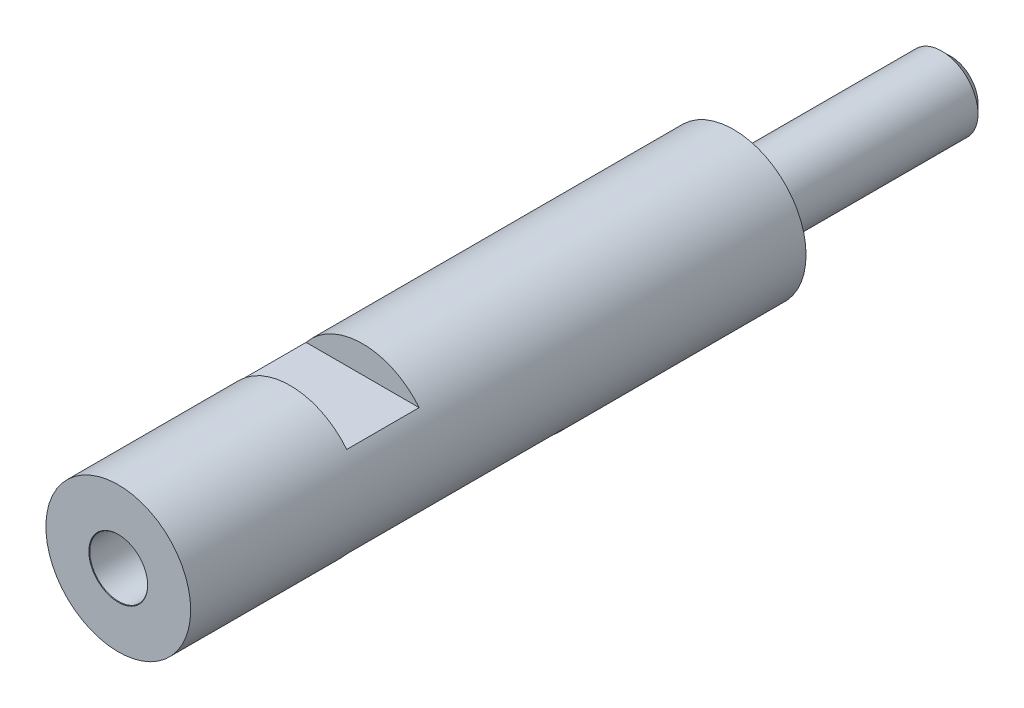
ISO-10303-21;
HEADER;
FILE_DESCRIPTION(('STEP AP214'),'2;1');
FILE_NAME('part.step','',(''),(''),'','','');
FILE_SCHEMA(('AUTOMOTIVE_DESIGN { 1 0 10303 214 1 1 1 1 }'));
ENDSEC;
DATA;
#1=APPLICATION_CONTEXT('core data for automotive mechanical design processes');
#2=APPLICATION_PROTOCOL_DEFINITION('international standard','automotive_design',2000,#1);
#3=PRODUCT_CONTEXT('',#1,'mechanical');
#4=PRODUCT('Part','Part','',(#3));
#5=PRODUCT_RELATED_PRODUCT_CATEGORY('part','',(#4));
#6=PRODUCT_DEFINITION_FORMATION('','',#4);
#7=PRODUCT_DEFINITION_CONTEXT('part definition',#1,'design');
#8=PRODUCT_DEFINITION('design','',#6,#7);
#9=PRODUCT_DEFINITION_SHAPE('','',#8);
#10=(LENGTH_UNIT() NAMED_UNIT(*) SI_UNIT(.MILLI.,.METRE.));
#11=(NAMED_UNIT(*) PLANE_ANGLE_UNIT() SI_UNIT($,.RADIAN.));
#12=(NAMED_UNIT(*) SI_UNIT($,.STERADIAN.) SOLID_ANGLE_UNIT());
#13=UNCERTAINTY_MEASURE_WITH_UNIT(LENGTH_MEASURE(1.E-05),#10,'distance_accuracy_value','');
#14=(GEOMETRIC_REPRESENTATION_CONTEXT(3) GLOBAL_UNCERTAINTY_ASSIGNED_CONTEXT((#13)) GLOBAL_UNIT_ASSIGNED_CONTEXT((#10,
#11,#12)) REPRESENTATION_CONTEXT('',''));
#15=CARTESIAN_POINT('',(0.,0.,0.));
#16=DIRECTION('',(0.,0.,1.));
#17=DIRECTION('',(1.,0.,0.));
#18=AXIS2_PLACEMENT_3D('',#15,#16,#17);
#19=CARTESIAN_POINT('',(0.,0.,34.));
#20=DIRECTION('',(0.,0.,-1.));
#21=DIRECTION('',(-1.,0.,0.));
#22=AXIS2_PLACEMENT_3D('',#19,#20,#21);
#23=CYLINDRICAL_SURFACE('',#22,4.);
#24=DIRECTION('',(0.,0.,-1.));
#25=VECTOR('',#24,1.);
#26=CARTESIAN_POINT('',(3.1224989991992,2.5,34.));
#27=LINE('',#26,#25);
#28=CARTESIAN_POINT('',(3.1224989991992,2.5,20.5));
#29=VERTEX_POINT('',#28);
#30=CARTESIAN_POINT('',(3.1224989991992,2.5,24.5));
#31=VERTEX_POINT('',#30);
#32=EDGE_CURVE('E131',#29,#31,#27,.F.);
#33=ORIENTED_EDGE('',*,*,#32,.T.);
#34=CARTESIAN_POINT('',(0.,0.,24.5));
#35=DIRECTION('',(0.,0.,1.));
#36=DIRECTION('',(1.,0.,0.));
#37=AXIS2_PLACEMENT_3D('',#34,#35,#36);
#38=CIRCLE('',#37,4.);
#39=CARTESIAN_POINT('',(-3.1224989991992,2.5,24.5));
#40=VERTEX_POINT('',#39);
#41=EDGE_CURVE('E61',#31,#40,#38,.T.);
#42=ORIENTED_EDGE('',*,*,#41,.T.);
#43=DIRECTION('',(0.,0.,-1.));
#44=VECTOR('',#43,1.);
#45=CARTESIAN_POINT('',(-3.1224989991992,2.5,34.));
#46=LINE('',#45,#44);
#47=CARTESIAN_POINT('',(-3.1224989991992,2.5,20.5));
#48=VERTEX_POINT('',#47);
#49=EDGE_CURVE('E134',#40,#48,#46,.T.);
#50=ORIENTED_EDGE('',*,*,#49,.T.);
#51=CARTESIAN_POINT('',(0.,0.,20.5));
#52=DIRECTION('',(0.,0.,-1.));
#53=DIRECTION('',(-1.,0.,0.));
#54=AXIS2_PLACEMENT_3D('',#51,#52,#53);
#55=CIRCLE('',#54,4.);
#56=EDGE_CURVE('E128',#48,#29,#55,.T.);
#57=ORIENTED_EDGE('',*,*,#56,.T.);
#58=EDGE_LOOP('',(#33,#42,#50,#57));
#59=FACE_BOUND('',#58,.T.);
#60=CARTESIAN_POINT('',(0.,0.,0.));
#61=DIRECTION('',(0.,0.,1.));
#62=DIRECTION('',(1.,0.,0.));
#63=AXIS2_PLACEMENT_3D('',#60,#61,#62);
#64=CIRCLE('',#63,4.);
#65=CARTESIAN_POINT('',(4.,0.,0.));
#66=VERTEX_POINT('',#65);
#67=EDGE_CURVE('E106',#66,#66,#64,.T.);
#68=ORIENTED_EDGE('',*,*,#67,.T.);
#69=EDGE_LOOP('',(#68));
#70=FACE_BOUND('',#69,.T.);
#71=CARTESIAN_POINT('',(0.,0.,34.));
#72=DIRECTION('',(0.,0.,1.));
#73=DIRECTION('',(1.,0.,0.));
#74=AXIS2_PLACEMENT_3D('',#71,#72,#73);
#75=CIRCLE('',#74,4.);
#76=CARTESIAN_POINT('',(4.,0.,34.));
#77=VERTEX_POINT('',#76);
#78=EDGE_CURVE('E110',#77,#77,#75,.T.);
#79=ORIENTED_EDGE('',*,*,#78,.F.);
#80=EDGE_LOOP('',(#79));
#81=FACE_BOUND('',#80,.T.);
#82=CARTESIAN_POINT('',(0.,0.,12.5));
#83=DIRECTION('',(0.,0.,1.));
#84=DIRECTION('',(1.,0.,0.));
#85=AXIS2_PLACEMENT_3D('',#82,#83,#84);
#86=CIRCLE('',#85,4.);
#87=CARTESIAN_POINT('',(-3.1224989991992,-2.5,12.5));
#88=VERTEX_POINT('',#87);
#89=CARTESIAN_POINT('',(3.1224989991992,-2.5,12.5));
#90=VERTEX_POINT('',#89);
#91=EDGE_CURVE('E126',#88,#90,#86,.T.);
#92=ORIENTED_EDGE('',*,*,#91,.F.);
#93=DIRECTION('',(0.,0.,-1.));
#94=VECTOR('',#93,1.);
#95=CARTESIAN_POINT('',(-3.1224989991992,-2.5,34.));
#96=LINE('',#95,#94);
#97=CARTESIAN_POINT('',(-3.1224989991992,-2.5,24.5));
#98=VERTEX_POINT('',#97);
#99=EDGE_CURVE('E123',#98,#88,#96,.T.);
#100=ORIENTED_EDGE('',*,*,#99,.F.);
#101=CARTESIAN_POINT('',(0.,0.,24.5));
#102=DIRECTION('',(0.,0.,-1.));
#103=DIRECTION('',(-1.,0.,0.));
#104=AXIS2_PLACEMENT_3D('',#101,#102,#103);
#105=CIRCLE('',#104,4.);
#106=CARTESIAN_POINT('',(3.1224989991992,-2.5,24.5));
#107=VERTEX_POINT('',#106);
#108=EDGE_CURVE('E118',#107,#98,#105,.T.);
#109=ORIENTED_EDGE('',*,*,#108,.F.);
#110=DIRECTION('',(0.,0.,-1.));
#111=VECTOR('',#110,1.);
#112=CARTESIAN_POINT('',(3.1224989991992,-2.5,34.));
#113=LINE('',#112,#111);
#114=EDGE_CURVE('E120',#90,#107,#113,.F.);
#115=ORIENTED_EDGE('',*,*,#114,.F.);
#116=EDGE_LOOP('',(#92,#100,#109,#115));
#117=FACE_BOUND('',#116,.T.);
#118=ADVANCED_FACE('F39',(#59,#70,#81,#117),#23,.T.);
#119=CARTESIAN_POINT('',(0.,0.,-12.));
#120=DIRECTION('',(0.,0.,1.));
#121=DIRECTION('',(1.,0.,0.));
#122=AXIS2_PLACEMENT_3D('',#119,#120,#121);
#123=CYLINDRICAL_SURFACE('',#122,2.);
#124=CARTESIAN_POINT('',(0.,0.,-11.5));
#125=DIRECTION('',(0.,0.,1.));
#126=DIRECTION('',(1.,0.,0.));
#127=AXIS2_PLACEMENT_3D('',#124,#125,#126);
#128=CIRCLE('',#127,2.);
#129=CARTESIAN_POINT('',(2.,0.,-11.5));
#130=VERTEX_POINT('',#129);
#131=EDGE_CURVE('E48',#130,#130,#128,.T.);
#132=ORIENTED_EDGE('',*,*,#131,.T.);
#133=EDGE_LOOP('',(#132));
#134=FACE_BOUND('',#133,.T.);
#135=CARTESIAN_POINT('',(0.,0.,0.));
#136=DIRECTION('',(0.,0.,1.));
#137=DIRECTION('',(1.,0.,0.));
#138=AXIS2_PLACEMENT_3D('',#135,#136,#137);
#139=CIRCLE('',#138,2.);
#140=CARTESIAN_POINT('',(2.,0.,0.));
#141=VERTEX_POINT('',#140);
#142=EDGE_CURVE('E113',#141,#141,#139,.T.);
#143=ORIENTED_EDGE('',*,*,#142,.F.);
#144=EDGE_LOOP('',(#143));
#145=FACE_BOUND('',#144,.T.);
#146=ADVANCED_FACE('F140',(#134,#145),#123,.T.);
#147=CARTESIAN_POINT('',(0.,0.,-12.));
#148=DIRECTION('',(0.,0.,1.));
#149=DIRECTION('',(1.,0.,0.));
#150=AXIS2_PLACEMENT_3D('',#147,#148,#149);
#151=PLANE('',#150);
#152=CARTESIAN_POINT('',(0.,0.,-12.));
#153=DIRECTION('',(0.,0.,1.));
#154=DIRECTION('',(1.,0.,0.));
#155=AXIS2_PLACEMENT_3D('',#152,#153,#154);
#156=CIRCLE('',#155,1.5);
#157=CARTESIAN_POINT('',(1.5,0.,-12.));
#158=VERTEX_POINT('',#157);
#159=EDGE_CURVE('E11',#158,#158,#156,.F.);
#160=ORIENTED_EDGE('',*,*,#159,.T.);
#161=EDGE_LOOP('',(#160));
#162=FACE_BOUND('',#161,.T.);
#163=ADVANCED_FACE('F158',(#162),#151,.F.);
#164=CARTESIAN_POINT('',(0.,0.,34.));
#165=DIRECTION('',(0.,0.,1.));
#166=DIRECTION('',(1.,0.,0.));
#167=AXIS2_PLACEMENT_3D('',#164,#165,#166);
#168=PLANE('',#167);
#169=CARTESIAN_POINT('',(0.,0.,34.));
#170=DIRECTION('',(0.,0.,1.));
#171=DIRECTION('',(1.,0.,0.));
#172=AXIS2_PLACEMENT_3D('',#169,#170,#171);
#173=CIRCLE('',#172,1.625);
#174=CARTESIAN_POINT('',(1.625,0.,34.));
#175=VERTEX_POINT('',#174);
#176=EDGE_CURVE('E100',#175,#175,#173,.T.);
#177=ORIENTED_EDGE('',*,*,#176,.F.);
#178=EDGE_LOOP('',(#177));
#179=FACE_BOUND('',#178,.T.);
#180=ORIENTED_EDGE('',*,*,#78,.T.);
#181=EDGE_LOOP('',(#180));
#182=FACE_BOUND('',#181,.T.);
#183=ADVANCED_FACE('F165',(#179,#182),#168,.T.);
#184=CARTESIAN_POINT('',(0.,0.,0.));
#185=DIRECTION('',(0.,0.,1.));
#186=DIRECTION('',(1.,0.,0.));
#187=AXIS2_PLACEMENT_3D('',#184,#185,#186);
#188=PLANE('',#187);
#189=ORIENTED_EDGE('',*,*,#142,.T.);
#190=EDGE_LOOP('',(#189));
#191=FACE_BOUND('',#190,.T.);
#192=ORIENTED_EDGE('',*,*,#67,.F.);
#193=EDGE_LOOP('',(#192));
#194=FACE_BOUND('',#193,.T.);
#195=ADVANCED_FACE('F162',(#191,#194),#188,.F.);
#196=CARTESIAN_POINT('',(-17.,-2.5,24.5));
#197=DIRECTION('',(0.,-1.,0.));
#198=DIRECTION('',(0.,0.,-1.));
#199=AXIS2_PLACEMENT_3D('',#196,#197,#198);
#200=PLANE('',#199);
#201=ORIENTED_EDGE('',*,*,#99,.T.);
#202=DIRECTION('',(1.,0.,0.));
#203=VECTOR('',#202,1.);
#204=CARTESIAN_POINT('',(-17.,-2.5,12.5));
#205=LINE('',#204,#203);
#206=EDGE_CURVE('E93',#88,#90,#205,.T.);
#207=ORIENTED_EDGE('',*,*,#206,.T.);
#208=ORIENTED_EDGE('',*,*,#114,.T.);
#209=DIRECTION('',(1.,0.,0.));
#210=VECTOR('',#209,1.);
#211=CARTESIAN_POINT('',(-17.,-2.5,24.5));
#212=LINE('',#211,#210);
#213=EDGE_CURVE('E97',#98,#107,#212,.T.);
#214=ORIENTED_EDGE('',*,*,#213,.F.);
#215=EDGE_LOOP('',(#201,#207,#208,#214));
#216=FACE_BOUND('',#215,.T.);
#217=ADVANCED_FACE('F174',(#216),#200,.T.);
#218=CARTESIAN_POINT('',(-17.,-2.5,12.5));
#219=DIRECTION('',(0.,0.,1.));
#220=DIRECTION('',(1.,0.,0.));
#221=AXIS2_PLACEMENT_3D('',#218,#219,#220);
#222=PLANE('',#221);
#223=ORIENTED_EDGE('',*,*,#206,.F.);
#224=ORIENTED_EDGE('',*,*,#91,.T.);
#225=EDGE_LOOP('',(#223,#224));
#226=FACE_BOUND('',#225,.T.);
#227=ADVANCED_FACE('F183',(#226),#222,.T.);
#228=CARTESIAN_POINT('',(-17.,-4.,24.5));
#229=DIRECTION('',(0.,0.,-1.));
#230=DIRECTION('',(-1.,0.,0.));
#231=AXIS2_PLACEMENT_3D('',#228,#229,#230);
#232=PLANE('',#231);
#233=ORIENTED_EDGE('',*,*,#213,.T.);
#234=ORIENTED_EDGE('',*,*,#108,.T.);
#235=EDGE_LOOP('',(#233,#234));
#236=FACE_BOUND('',#235,.T.);
#237=ADVANCED_FACE('F179',(#236),#232,.T.);
#238=CARTESIAN_POINT('',(-17.,2.5,24.5));
#239=DIRECTION('',(0.,-1.,0.));
#240=DIRECTION('',(0.,0.,-1.));
#241=AXIS2_PLACEMENT_3D('',#238,#239,#240);
#242=PLANE('',#241);
#243=DIRECTION('',(1.,0.,0.));
#244=VECTOR('',#243,1.);
#245=CARTESIAN_POINT('',(-17.,2.5,24.5));
#246=LINE('',#245,#244);
#247=EDGE_CURVE('E104',#40,#31,#246,.T.);
#248=ORIENTED_EDGE('',*,*,#247,.T.);
#249=ORIENTED_EDGE('',*,*,#32,.F.);
#250=DIRECTION('',(1.,0.,0.));
#251=VECTOR('',#250,1.);
#252=CARTESIAN_POINT('',(-17.,2.5,20.5));
#253=LINE('',#252,#251);
#254=EDGE_CURVE('E54',#48,#29,#253,.T.);
#255=ORIENTED_EDGE('',*,*,#254,.F.);
#256=ORIENTED_EDGE('',*,*,#49,.F.);
#257=EDGE_LOOP('',(#248,#249,#255,#256));
#258=FACE_BOUND('',#257,.T.);
#259=ADVANCED_FACE('F182',(#258),#242,.F.);
#260=CARTESIAN_POINT('',(-17.,4.,24.5));
#261=DIRECTION('',(0.,0.,1.));
#262=DIRECTION('',(1.,0.,0.));
#263=AXIS2_PLACEMENT_3D('',#260,#261,#262);
#264=PLANE('',#263);
#265=ORIENTED_EDGE('',*,*,#247,.F.);
#266=ORIENTED_EDGE('',*,*,#41,.F.);
#267=EDGE_LOOP('',(#265,#266));
#268=FACE_BOUND('',#267,.T.);
#269=ADVANCED_FACE('F193',(#268),#264,.F.);
#270=CARTESIAN_POINT('',(-17.,2.5,20.5));
#271=DIRECTION('',(0.,0.,-1.));
#272=DIRECTION('',(-1.,0.,0.));
#273=AXIS2_PLACEMENT_3D('',#270,#271,#272);
#274=PLANE('',#273);
#275=ORIENTED_EDGE('',*,*,#254,.T.);
#276=ORIENTED_EDGE('',*,*,#56,.F.);
#277=EDGE_LOOP('',(#275,#276));
#278=FACE_BOUND('',#277,.T.);
#279=ADVANCED_FACE('F87',(#278),#274,.F.);
#280=CARTESIAN_POINT('',(0.,0.,20.));
#281=DIRECTION('',(0.,0.,1.));
#282=DIRECTION('',(1.,0.,0.));
#283=AXIS2_PLACEMENT_3D('',#280,#281,#282);
#284=CONICAL_SURFACE('',#283,1.59999999999999,1.02974425867665);
#285=CARTESIAN_POINT('',(0.,0.,19.0386230095559));
#286=VERTEX_POINT('',#285);
#287=VERTEX_LOOP('',#286);
#288=FACE_BOUND('',#287,.T.);
#289=CARTESIAN_POINT('',(0.,0.,20.));
#290=DIRECTION('',(0.,0.,1.));
#291=DIRECTION('',(1.,0.,0.));
#292=AXIS2_PLACEMENT_3D('',#289,#290,#291);
#293=CIRCLE('',#292,1.59999999999999);
#294=CARTESIAN_POINT('',(1.59999999999999,0.,20.));
#295=VERTEX_POINT('',#294);
#296=EDGE_CURVE('E91',#295,#295,#293,.T.);
#297=ORIENTED_EDGE('',*,*,#296,.T.);
#298=EDGE_LOOP('',(#297));
#299=FACE_BOUND('',#298,.T.);
#300=ADVANCED_FACE('F83',(#288,#299),#284,.F.);
#301=CARTESIAN_POINT('',(0.,0.,34.));
#302=DIRECTION('',(0.,0.,1.));
#303=DIRECTION('',(1.,0.,0.));
#304=AXIS2_PLACEMENT_3D('',#301,#302,#303);
#305=CYLINDRICAL_SURFACE('',#304,1.59999999999999);
#306=ORIENTED_EDGE('',*,*,#296,.F.);
#307=EDGE_LOOP('',(#306));
#308=FACE_BOUND('',#307,.T.);
#309=CARTESIAN_POINT('',(0.,0.,33.975));
#310=DIRECTION('',(0.,0.,1.));
#311=DIRECTION('',(1.,0.,0.));
#312=AXIS2_PLACEMENT_3D('',#309,#310,#311);
#313=CIRCLE('',#312,1.59999999999999);
#314=CARTESIAN_POINT('',(1.59999999999999,0.,33.975));
#315=VERTEX_POINT('',#314);
#316=EDGE_CURVE('E94',#315,#315,#313,.T.);
#317=ORIENTED_EDGE('',*,*,#316,.T.);
#318=EDGE_LOOP('',(#317));
#319=FACE_BOUND('',#318,.T.);
#320=ADVANCED_FACE('F86',(#308,#319),#305,.F.);
#321=CARTESIAN_POINT('',(0.,0.,34.));
#322=DIRECTION('',(0.,0.,1.));
#323=DIRECTION('',(1.,0.,0.));
#324=AXIS2_PLACEMENT_3D('',#321,#322,#323);
#325=CONICAL_SURFACE('',#324,1.625,0.785398163398003);
#326=ORIENTED_EDGE('',*,*,#316,.F.);
#327=EDGE_LOOP('',(#326));
#328=FACE_BOUND('',#327,.T.);
#329=ORIENTED_EDGE('',*,*,#176,.T.);
#330=EDGE_LOOP('',(#329));
#331=FACE_BOUND('',#330,.T.);
#332=ADVANCED_FACE('F144',(#328,#331),#325,.F.);
#333=CARTESIAN_POINT('',(0.,0.,-11.5));
#334=DIRECTION('',(0.,0.,1.));
#335=DIRECTION('',(1.,0.,0.));
#336=AXIS2_PLACEMENT_3D('',#333,#334,#335);
#337=CONICAL_SURFACE('',#336,2.,0.785398163397448);
#338=ORIENTED_EDGE('',*,*,#159,.F.);
#339=EDGE_LOOP('',(#338));
#340=FACE_BOUND('',#339,.T.);
#341=ORIENTED_EDGE('',*,*,#131,.F.);
#342=EDGE_LOOP('',(#341));
#343=FACE_BOUND('',#342,.T.);
#344=ADVANCED_FACE('F42',(#340,#343),#337,.T.);
#345=CLOSED_SHELL('',(#118,#146,#163,#183,#195,#217,#227,#237,#259,#269,#279,#300,#320,#332,#344));
#346=MANIFOLD_SOLID_BREP('B2',#345);
#347=ADVANCED_BREP_SHAPE_REPRESENTATION('',(#18,#346),#14);
#348=SHAPE_DEFINITION_REPRESENTATION(#9,#347);
ENDSEC;
END-ISO-10303-21;
